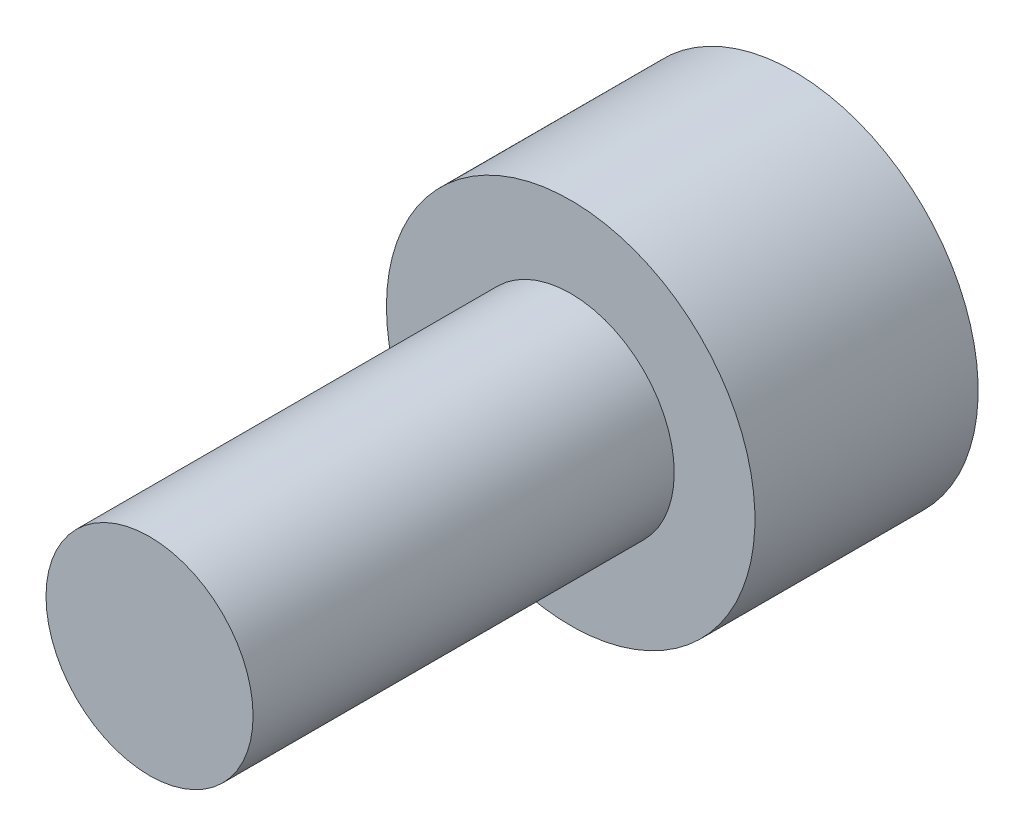
ISO-10303-21;
HEADER;
FILE_DESCRIPTION(('STEP AP214'),'2;1');
FILE_NAME('part.step','',(''),(''),'','','');
FILE_SCHEMA(('AUTOMOTIVE_DESIGN { 1 0 10303 214 1 1 1 1 }'));
ENDSEC;
DATA;
#1=APPLICATION_CONTEXT('core data for automotive mechanical design processes');
#2=APPLICATION_PROTOCOL_DEFINITION('international standard','automotive_design',2000,#1);
#3=PRODUCT_CONTEXT('',#1,'mechanical');
#4=PRODUCT('Part','Part','',(#3));
#5=PRODUCT_RELATED_PRODUCT_CATEGORY('part','',(#4));
#6=PRODUCT_DEFINITION_FORMATION('','',#4);
#7=PRODUCT_DEFINITION_CONTEXT('part definition',#1,'design');
#8=PRODUCT_DEFINITION('design','',#6,#7);
#9=PRODUCT_DEFINITION_SHAPE('','',#8);
#10=(LENGTH_UNIT() NAMED_UNIT(*) SI_UNIT(.MILLI.,.METRE.));
#11=(NAMED_UNIT(*) PLANE_ANGLE_UNIT() SI_UNIT($,.RADIAN.));
#12=(NAMED_UNIT(*) SI_UNIT($,.STERADIAN.) SOLID_ANGLE_UNIT());
#13=UNCERTAINTY_MEASURE_WITH_UNIT(LENGTH_MEASURE(1.E-05),#10,'distance_accuracy_value','');
#14=(GEOMETRIC_REPRESENTATION_CONTEXT(3) GLOBAL_UNCERTAINTY_ASSIGNED_CONTEXT((#13)) GLOBAL_UNIT_ASSIGNED_CONTEXT((#10,
#11,#12)) REPRESENTATION_CONTEXT('',''));
#15=CARTESIAN_POINT('',(0.,0.,0.));
#16=DIRECTION('',(0.,0.,1.));
#17=DIRECTION('',(1.,0.,0.));
#18=AXIS2_PLACEMENT_3D('',#15,#16,#17);
#19=CARTESIAN_POINT('',(0.,0.,3.18));
#20=DIRECTION('',(0.,0.,-1.));
#21=DIRECTION('',(-1.,0.,0.));
#22=AXIS2_PLACEMENT_3D('',#19,#20,#21);
#23=CYLINDRICAL_SURFACE('',#22,2.625);
#24=CARTESIAN_POINT('',(0.,0.,3.18));
#25=DIRECTION('',(0.,0.,1.));
#26=DIRECTION('',(1.,0.,0.));
#27=AXIS2_PLACEMENT_3D('',#24,#25,#26);
#28=CIRCLE('',#27,2.625);
#29=CARTESIAN_POINT('',(-2.625,0.,3.18));
#30=VERTEX_POINT('',#29);
#31=EDGE_CURVE('E42',#30,#30,#28,.T.);
#32=CARTESIAN_POINT('',(0.,0.,0.));
#33=DIRECTION('',(0.,0.,1.));
#34=DIRECTION('',(1.,0.,0.));
#35=AXIS2_PLACEMENT_3D('',#32,#33,#34);
#36=CIRCLE('',#35,2.625);
#37=CARTESIAN_POINT('',(-2.625,0.,0.));
#38=VERTEX_POINT('',#37);
#39=EDGE_CURVE('E38',#38,#38,#36,.T.);
#40=CARTESIAN_POINT('',(-2.625,0.,3.18));
#41=CARTESIAN_POINT('',(-2.625,0.,3.146875));
#42=CARTESIAN_POINT('',(-2.625,0.,3.11375));
#43=CARTESIAN_POINT('',(-2.625,0.,3.0475));
#44=CARTESIAN_POINT('',(-2.625,0.,3.014375));
#45=CARTESIAN_POINT('',(-2.625,0.,2.948125));
#46=CARTESIAN_POINT('',(-2.625,0.,2.915));
#47=CARTESIAN_POINT('',(-2.625,0.,2.84875));
#48=CARTESIAN_POINT('',(-2.625,0.,2.815625));
#49=CARTESIAN_POINT('',(-2.625,0.,2.749375));
#50=CARTESIAN_POINT('',(-2.625,0.,2.71625));
#51=CARTESIAN_POINT('',(-2.625,0.,2.65));
#52=CARTESIAN_POINT('',(-2.625,0.,2.616875));
#53=CARTESIAN_POINT('',(-2.625,0.,2.550625));
#54=CARTESIAN_POINT('',(-2.625,0.,2.5175));
#55=CARTESIAN_POINT('',(-2.625,0.,2.45125));
#56=CARTESIAN_POINT('',(-2.625,0.,2.418125));
#57=CARTESIAN_POINT('',(-2.625,0.,2.351875));
#58=CARTESIAN_POINT('',(-2.625,0.,2.31875));
#59=CARTESIAN_POINT('',(-2.625,0.,2.2525));
#60=CARTESIAN_POINT('',(-2.625,0.,2.219375));
#61=CARTESIAN_POINT('',(-2.625,0.,2.153125));
#62=CARTESIAN_POINT('',(-2.625,0.,2.12));
#63=CARTESIAN_POINT('',(-2.625,0.,2.05375));
#64=CARTESIAN_POINT('',(-2.625,0.,2.020625));
#65=CARTESIAN_POINT('',(-2.625,0.,1.954375));
#66=CARTESIAN_POINT('',(-2.625,0.,1.92125));
#67=CARTESIAN_POINT('',(-2.625,0.,1.855));
#68=CARTESIAN_POINT('',(-2.625,0.,1.821875));
#69=CARTESIAN_POINT('',(-2.625,0.,1.755625));
#70=CARTESIAN_POINT('',(-2.625,0.,1.7225));
#71=CARTESIAN_POINT('',(-2.625,0.,1.65625));
#72=CARTESIAN_POINT('',(-2.625,0.,1.623125));
#73=CARTESIAN_POINT('',(-2.625,0.,1.556875));
#74=CARTESIAN_POINT('',(-2.625,0.,1.52375));
#75=CARTESIAN_POINT('',(-2.625,0.,1.4575));
#76=CARTESIAN_POINT('',(-2.625,0.,1.424375));
#77=CARTESIAN_POINT('',(-2.625,0.,1.358125));
#78=CARTESIAN_POINT('',(-2.625,0.,1.325));
#79=CARTESIAN_POINT('',(-2.625,0.,1.25875));
#80=CARTESIAN_POINT('',(-2.625,0.,1.225625));
#81=CARTESIAN_POINT('',(-2.625,0.,1.159375));
#82=CARTESIAN_POINT('',(-2.625,0.,1.12625));
#83=CARTESIAN_POINT('',(-2.625,0.,1.06));
#84=CARTESIAN_POINT('',(-2.625,0.,1.026875));
#85=CARTESIAN_POINT('',(-2.625,0.,0.960625));
#86=CARTESIAN_POINT('',(-2.625,0.,0.9275));
#87=CARTESIAN_POINT('',(-2.625,0.,0.86125));
#88=CARTESIAN_POINT('',(-2.625,0.,0.828125));
#89=CARTESIAN_POINT('',(-2.625,0.,0.761875));
#90=CARTESIAN_POINT('',(-2.625,0.,0.72875));
#91=CARTESIAN_POINT('',(-2.625,0.,0.6625));
#92=CARTESIAN_POINT('',(-2.625,0.,0.629375));
#93=CARTESIAN_POINT('',(-2.625,0.,0.563125));
#94=CARTESIAN_POINT('',(-2.625,0.,0.53));
#95=CARTESIAN_POINT('',(-2.625,0.,0.46375));
#96=CARTESIAN_POINT('',(-2.625,0.,0.430625));
#97=CARTESIAN_POINT('',(-2.625,0.,0.364375));
#98=CARTESIAN_POINT('',(-2.625,0.,0.33125));
#99=CARTESIAN_POINT('',(-2.625,0.,0.265));
#100=CARTESIAN_POINT('',(-2.625,0.,0.231875));
#101=CARTESIAN_POINT('',(-2.625,0.,0.165625));
#102=CARTESIAN_POINT('',(-2.625,0.,0.1325));
#103=CARTESIAN_POINT('',(-2.625,0.,0.06625));
#104=CARTESIAN_POINT('',(-2.625,0.,0.033125));
#105=CARTESIAN_POINT('',(-2.625,0.,0.));
#106=B_SPLINE_CURVE_WITH_KNOTS('',3,(#40,#41,#42,#43,#44,#45,#46,#47,#48,#49,#50,#51,#52,#53,
#54,#55,#56,#57,#58,#59,#60,#61,#62,#63,#64,#65,#66,#67,#68,#69,#70,#71,#72,#73,#74,#75,#76,#77,
#78,#79,#80,#81,#82,#83,#84,#85,#86,#87,#88,#89,#90,#91,#92,#93,#94,#95,#96,#97,#98,#99,#100,
#101,#102,#103,#104,#105),.UNSPECIFIED.,.F.,.F.,(4,2,2,2,2,2,2,2,2,2,2,2,2,2,2,2,2,2,2,2,2,2,2,
2,2,2,2,2,2,2,2,2,4),(0.,0.0993749999999996,0.19875,0.298125,0.3975,0.496875,0.59625,0.695625,
0.795,0.894375,0.99375,1.093125,1.1925,1.291875,1.39125,1.490625,1.59,1.689375,1.78875,1.888125,
1.9875,2.086875,2.18625,2.285625,2.385,2.484375,2.58375,2.683125,2.7825,2.881875,2.98125,
3.080625,3.18),.UNSPECIFIED.);
#107=EDGE_CURVE('BSEAM35',#30,#38,#106,.T.);
#108=ORIENTED_EDGE('',*,*,#31,.F.);
#109=ORIENTED_EDGE('',*,*,#39,.T.);
#110=ORIENTED_EDGE('',*,*,#107,.T.);
#111=ORIENTED_EDGE('',*,*,#107,.F.);
#112=EDGE_LOOP('',(#108,#110,#109,#111));
#113=FACE_BOUND('',#112,.T.);
#114=ADVANCED_FACE('F35',(#113),#23,.T.);
#115=CARTESIAN_POINT('',(0.,0.,3.18));
#116=DIRECTION('',(0.,0.,1.));
#117=DIRECTION('',(1.,0.,0.));
#118=AXIS2_PLACEMENT_3D('',#115,#116,#117);
#119=PLANE('',#118);
#120=CARTESIAN_POINT('',(0.,0.,3.18));
#121=DIRECTION('',(0.,0.,1.));
#122=DIRECTION('',(1.,0.,0.));
#123=AXIS2_PLACEMENT_3D('',#120,#121,#122);
#124=CIRCLE('',#123,1.475);
#125=CARTESIAN_POINT('',(1.475,0.,3.18));
#126=VERTEX_POINT('',#125);
#127=EDGE_CURVE('E10',#126,#126,#124,.T.);
#128=ORIENTED_EDGE('',*,*,#127,.F.);
#129=EDGE_LOOP('',(#128));
#130=FACE_BOUND('',#129,.T.);
#131=ORIENTED_EDGE('',*,*,#31,.T.);
#132=EDGE_LOOP('',(#131));
#133=FACE_BOUND('',#132,.T.);
#134=ADVANCED_FACE('F59',(#130,#133),#119,.T.);
#135=CARTESIAN_POINT('',(0.,0.,0.));
#136=DIRECTION('',(0.,0.,1.));
#137=DIRECTION('',(1.,0.,0.));
#138=AXIS2_PLACEMENT_3D('',#135,#136,#137);
#139=PLANE('',#138);
#140=ORIENTED_EDGE('',*,*,#39,.F.);
#141=EDGE_LOOP('',(#140));
#142=FACE_BOUND('',#141,.T.);
#143=ADVANCED_FACE('F56',(#142),#139,.F.);
#144=CARTESIAN_POINT('',(0.,0.,9.18));
#145=DIRECTION('',(0.,0.,-1.));
#146=DIRECTION('',(-1.,0.,0.));
#147=AXIS2_PLACEMENT_3D('',#144,#145,#146);
#148=CYLINDRICAL_SURFACE('',#147,1.475);
#149=CARTESIAN_POINT('',(0.,0.,9.18));
#150=DIRECTION('',(0.,0.,1.));
#151=DIRECTION('',(1.,0.,0.));
#152=AXIS2_PLACEMENT_3D('',#149,#150,#151);
#153=CIRCLE('',#152,1.475);
#154=CARTESIAN_POINT('',(1.475,0.,9.18));
#155=VERTEX_POINT('',#154);
#156=EDGE_CURVE('E48',#155,#155,#153,.T.);
#157=ORIENTED_EDGE('',*,*,#156,.F.);
#158=EDGE_LOOP('',(#157));
#159=FACE_BOUND('',#158,.T.);
#160=ORIENTED_EDGE('',*,*,#127,.T.);
#161=EDGE_LOOP('',(#160));
#162=FACE_BOUND('',#161,.T.);
#163=ADVANCED_FACE('F58',(#159,#162),#148,.T.);
#164=CARTESIAN_POINT('',(0.,0.,9.18));
#165=DIRECTION('',(0.,0.,1.));
#166=DIRECTION('',(1.,0.,0.));
#167=AXIS2_PLACEMENT_3D('',#164,#165,#166);
#168=PLANE('',#167);
#169=ORIENTED_EDGE('',*,*,#156,.T.);
#170=EDGE_LOOP('',(#169));
#171=FACE_BOUND('',#170,.T.);
#172=ADVANCED_FACE('F64',(#171),#168,.T.);
#173=CLOSED_SHELL('',(#114,#134,#143,#163,#172));
#174=MANIFOLD_SOLID_BREP('B2',#173);
#175=ADVANCED_BREP_SHAPE_REPRESENTATION('',(#18,#174),#14);
#176=SHAPE_DEFINITION_REPRESENTATION(#9,#175);
ENDSEC;
END-ISO-10303-21;
